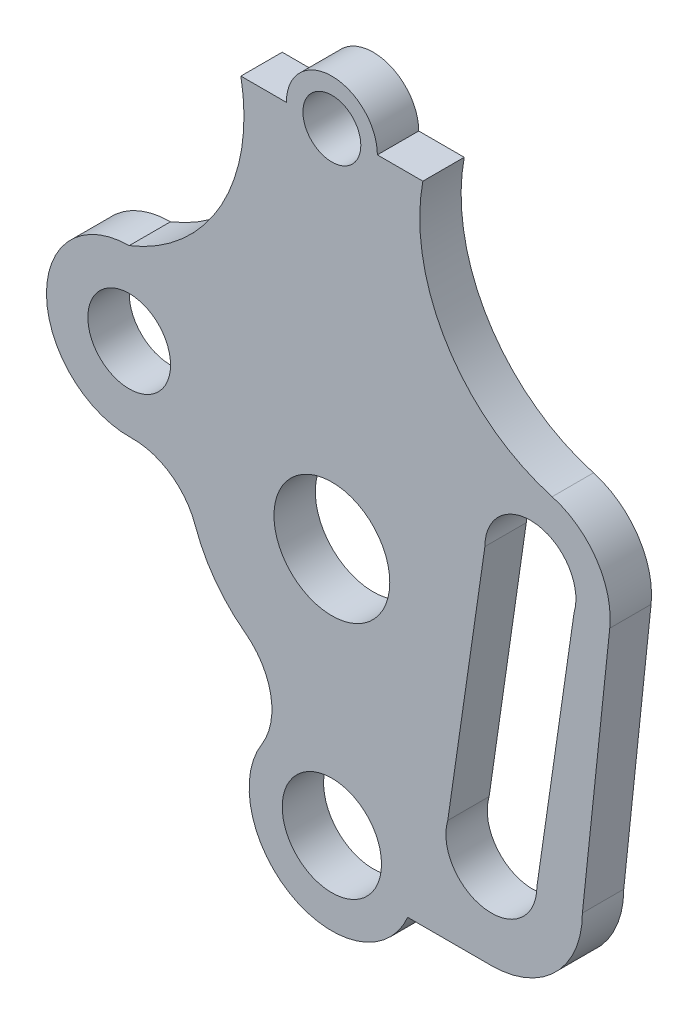
ISO-10303-21;
HEADER;
FILE_DESCRIPTION(('STEP AP214'),'2;1');
FILE_NAME('part.step','',(''),(''),'','','');
FILE_SCHEMA(('AUTOMOTIVE_DESIGN { 1 0 10303 214 1 1 1 1 }'));
ENDSEC;
DATA;
#1=APPLICATION_CONTEXT('core data for automotive mechanical design processes');
#2=APPLICATION_PROTOCOL_DEFINITION('international standard','automotive_design',2000,#1);
#3=PRODUCT_CONTEXT('',#1,'mechanical');
#4=PRODUCT('Part','Part','',(#3));
#5=PRODUCT_RELATED_PRODUCT_CATEGORY('part','',(#4));
#6=PRODUCT_DEFINITION_FORMATION('','',#4);
#7=PRODUCT_DEFINITION_CONTEXT('part definition',#1,'design');
#8=PRODUCT_DEFINITION('design','',#6,#7);
#9=PRODUCT_DEFINITION_SHAPE('','',#8);
#10=(LENGTH_UNIT() NAMED_UNIT(*) SI_UNIT(.MILLI.,.METRE.));
#11=(NAMED_UNIT(*) PLANE_ANGLE_UNIT() SI_UNIT($,.RADIAN.));
#12=(NAMED_UNIT(*) SI_UNIT($,.STERADIAN.) SOLID_ANGLE_UNIT());
#13=UNCERTAINTY_MEASURE_WITH_UNIT(LENGTH_MEASURE(1.E-05),#10,'distance_accuracy_value','');
#14=(GEOMETRIC_REPRESENTATION_CONTEXT(3) GLOBAL_UNCERTAINTY_ASSIGNED_CONTEXT((#13)) GLOBAL_UNIT_ASSIGNED_CONTEXT((#10,
#11,#12)) REPRESENTATION_CONTEXT('',''));
#15=CARTESIAN_POINT('',(0.,0.,0.));
#16=DIRECTION('',(0.,0.,1.));
#17=DIRECTION('',(1.,0.,0.));
#18=AXIS2_PLACEMENT_3D('',#15,#16,#17);
#19=CARTESIAN_POINT('',(-30.4997438513834,-40.875,5.));
#20=DIRECTION('',(0.,0.,-1.));
#21=DIRECTION('',(-1.,0.,0.));
#22=AXIS2_PLACEMENT_3D('',#19,#20,#21);
#23=CYLINDRICAL_SURFACE('',#22,16.);
#24=CARTESIAN_POINT('',(-30.4997438513834,-40.875,-5.));
#25=DIRECTION('',(0.,0.,1.));
#26=DIRECTION('',(1.,0.,0.));
#27=AXIS2_PLACEMENT_3D('',#24,#25,#26);
#28=CIRCLE('',#27,16.);
#29=CARTESIAN_POINT('',(-16.9443021396574,-49.375,-5.));
#30=VERTEX_POINT('',#29);
#31=CARTESIAN_POINT('',(-20.9311967607533,-28.0514705882353,-5.));
#32=VERTEX_POINT('',#31);
#33=EDGE_CURVE('E305',#30,#32,#28,.T.);
#34=ORIENTED_EDGE('',*,*,#33,.F.);
#35=DIRECTION('',(0.,0.,-1.));
#36=VECTOR('',#35,1.);
#37=CARTESIAN_POINT('',(-16.9443021396574,-49.375,5.));
#38=LINE('',#37,#36);
#39=CARTESIAN_POINT('',(-16.9443021396574,-49.375,5.));
#40=VERTEX_POINT('',#39);
#41=EDGE_CURVE('E11',#40,#30,#38,.T.);
#42=ORIENTED_EDGE('',*,*,#41,.F.);
#43=CARTESIAN_POINT('',(-30.4997438513834,-40.875,5.));
#44=DIRECTION('',(0.,0.,1.));
#45=DIRECTION('',(1.,0.,0.));
#46=AXIS2_PLACEMENT_3D('',#43,#44,#45);
#47=CIRCLE('',#46,16.);
#48=CARTESIAN_POINT('',(-20.9311967607533,-28.0514705882353,5.));
#49=VERTEX_POINT('',#48);
#50=EDGE_CURVE('E377',#40,#49,#47,.T.);
#51=ORIENTED_EDGE('',*,*,#50,.T.);
#52=DIRECTION('',(0.,0.,-1.));
#53=VECTOR('',#52,1.);
#54=CARTESIAN_POINT('',(-20.9311967607533,-28.0514705882353,5.));
#55=LINE('',#54,#53);
#56=EDGE_CURVE('E127',#49,#32,#55,.T.);
#57=ORIENTED_EDGE('',*,*,#56,.T.);
#58=EDGE_LOOP('',(#34,#42,#51,#57));
#59=FACE_BOUND('',#58,.T.);
#60=ADVANCED_FACE('F43',(#59),#23,.F.);
#61=CARTESIAN_POINT('',(0.,-60.,5.));
#62=DIRECTION('',(0.,0.,-1.));
#63=DIRECTION('',(-1.,0.,0.));
#64=AXIS2_PLACEMENT_3D('',#61,#62,#63);
#65=CYLINDRICAL_SURFACE('',#64,20.);
#66=CARTESIAN_POINT('',(0.,-60.,-5.));
#67=DIRECTION('',(0.,0.,1.));
#68=DIRECTION('',(1.,0.,0.));
#69=AXIS2_PLACEMENT_3D('',#66,#67,#68);
#70=CIRCLE('',#69,20.);
#71=CARTESIAN_POINT('',(18.3465511969433,-67.9626665871389,-5.));
#72=VERTEX_POINT('',#71);
#73=EDGE_CURVE('E301',#30,#72,#70,.T.);
#74=ORIENTED_EDGE('',*,*,#73,.T.);
#75=DIRECTION('',(0.,0.,-1.));
#76=VECTOR('',#75,1.);
#77=CARTESIAN_POINT('',(18.3465511969433,-67.9626665871389,5.));
#78=LINE('',#77,#76);
#79=CARTESIAN_POINT('',(18.3465511969433,-67.9626665871389,5.));
#80=VERTEX_POINT('',#79);
#81=EDGE_CURVE('E54',#80,#72,#78,.T.);
#82=ORIENTED_EDGE('',*,*,#81,.F.);
#83=CARTESIAN_POINT('',(0.,-60.,5.));
#84=DIRECTION('',(0.,0.,1.));
#85=DIRECTION('',(1.,0.,0.));
#86=AXIS2_PLACEMENT_3D('',#83,#84,#85);
#87=CIRCLE('',#86,20.);
#88=EDGE_CURVE('E373',#40,#80,#87,.T.);
#89=ORIENTED_EDGE('',*,*,#88,.F.);
#90=ORIENTED_EDGE('',*,*,#41,.T.);
#91=EDGE_LOOP('',(#74,#82,#89,#90));
#92=FACE_BOUND('',#91,.T.);
#93=ADVANCED_FACE('F442',(#92),#65,.T.);
#94=CARTESIAN_POINT('',(0.,-67.9626665871389,5.));
#95=DIRECTION('',(0.,1.,0.));
#96=DIRECTION('',(0.,0.,1.));
#97=AXIS2_PLACEMENT_3D('',#94,#95,#96);
#98=PLANE('',#97);
#99=DIRECTION('',(1.,0.,0.));
#100=VECTOR('',#99,1.);
#101=CARTESIAN_POINT('',(0.,-67.9626665871389,-5.));
#102=LINE('',#101,#100);
#103=CARTESIAN_POINT('',(38.5672565811921,-67.9626665871389,-5.));
#104=VERTEX_POINT('',#103);
#105=EDGE_CURVE('E297',#72,#104,#102,.T.);
#106=ORIENTED_EDGE('',*,*,#105,.T.);
#107=DIRECTION('',(0.,0.,-1.));
#108=VECTOR('',#107,1.);
#109=CARTESIAN_POINT('',(38.5672565811921,-67.9626665871389,5.));
#110=LINE('',#109,#108);
#111=CARTESIAN_POINT('',(38.5672565811921,-67.9626665871389,5.));
#112=VERTEX_POINT('',#111);
#113=EDGE_CURVE('E234',#112,#104,#110,.T.);
#114=ORIENTED_EDGE('',*,*,#113,.F.);
#115=DIRECTION('',(1.,0.,0.));
#116=VECTOR('',#115,1.);
#117=CARTESIAN_POINT('',(0.,-67.9626665871389,5.));
#118=LINE('',#117,#116);
#119=EDGE_CURVE('E369',#80,#112,#118,.T.);
#120=ORIENTED_EDGE('',*,*,#119,.F.);
#121=ORIENTED_EDGE('',*,*,#81,.T.);
#122=EDGE_LOOP('',(#106,#114,#120,#121));
#123=FACE_BOUND('',#122,.T.);
#124=ADVANCED_FACE('F447',(#123),#98,.F.);
#125=CARTESIAN_POINT('',(38.5672565811921,-45.9626665871389,5.));
#126=DIRECTION('',(0.,0.,-1.));
#127=DIRECTION('',(-1.,0.,0.));
#128=AXIS2_PLACEMENT_3D('',#125,#126,#127);
#129=CYLINDRICAL_SURFACE('',#128,22.);
#130=CARTESIAN_POINT('',(38.5672565811921,-45.9626665871389,-5.));
#131=DIRECTION('',(0.,0.,1.));
#132=DIRECTION('',(1.,0.,0.));
#133=AXIS2_PLACEMENT_3D('',#130,#131,#132);
#134=CIRCLE('',#133,22.);
#135=CARTESIAN_POINT('',(60.5672565811921,-45.9626665871389,-5.));
#136=VERTEX_POINT('',#135);
#137=EDGE_CURVE('E293',#104,#136,#134,.T.);
#138=ORIENTED_EDGE('',*,*,#137,.T.);
#139=DIRECTION('',(0.,0.,-1.));
#140=VECTOR('',#139,1.);
#141=CARTESIAN_POINT('',(60.5672565811921,-45.9626665871389,5.));
#142=LINE('',#141,#140);
#143=CARTESIAN_POINT('',(60.5672565811921,-45.9626665871389,5.));
#144=VERTEX_POINT('',#143);
#145=EDGE_CURVE('E231',#144,#136,#142,.T.);
#146=ORIENTED_EDGE('',*,*,#145,.F.);
#147=CARTESIAN_POINT('',(38.5672565811921,-45.9626665871389,5.));
#148=DIRECTION('',(0.,0.,1.));
#149=DIRECTION('',(1.,0.,0.));
#150=AXIS2_PLACEMENT_3D('',#147,#148,#149);
#151=CIRCLE('',#150,22.);
#152=EDGE_CURVE('E366',#112,#144,#151,.T.);
#153=ORIENTED_EDGE('',*,*,#152,.F.);
#154=ORIENTED_EDGE('',*,*,#113,.T.);
#155=EDGE_LOOP('',(#138,#146,#153,#154));
#156=FACE_BOUND('',#155,.T.);
#157=ADVANCED_FACE('F648',(#156),#129,.T.);
#158=CARTESIAN_POINT('',(64.6821409647,-6.79547069058715,5.));
#159=DIRECTION('',(0.994526523743526,-0.104484417836431,0.));
#160=DIRECTION('',(0.104484417836431,0.994526523743526,0.));
#161=AXIS2_PLACEMENT_3D('',#158,#159,#160);
#162=PLANE('',#161);
#163=DIRECTION('',(-0.104484417836431,-0.994526523743526,0.));
#164=VECTOR('',#163,1.);
#165=CARTESIAN_POINT('',(64.6821409647,-6.79547069058715,-5.));
#166=LINE('',#165,#164);
#167=CARTESIAN_POINT('',(67.1804946283581,16.9849076246702,-5.));
#168=VERTEX_POINT('',#167);
#169=EDGE_CURVE('E289',#168,#136,#166,.T.);
#170=ORIENTED_EDGE('',*,*,#169,.F.);
#171=DIRECTION('',(0.,0.,-1.));
#172=VECTOR('',#171,1.);
#173=CARTESIAN_POINT('',(67.1804946283581,16.9849076246702,5.));
#174=LINE('',#173,#172);
#175=CARTESIAN_POINT('',(67.1804946283581,16.9849076246702,5.));
#176=VERTEX_POINT('',#175);
#177=EDGE_CURVE('E228',#176,#168,#174,.T.);
#178=ORIENTED_EDGE('',*,*,#177,.F.);
#179=DIRECTION('',(-0.104484417836431,-0.994526523743526,0.));
#180=VECTOR('',#179,1.);
#181=CARTESIAN_POINT('',(64.6821409647,-6.79547069058715,5.));
#182=LINE('',#181,#180);
#183=EDGE_CURVE('E362',#176,#144,#182,.T.);
#184=ORIENTED_EDGE('',*,*,#183,.T.);
#185=ORIENTED_EDGE('',*,*,#145,.T.);
#186=EDGE_LOOP('',(#170,#178,#184,#185));
#187=FACE_BOUND('',#186,.T.);
#188=ADVANCED_FACE('F637',(#187),#162,.T.);
#189=CARTESIAN_POINT('',(48.,19.,5.));
#190=DIRECTION('',(0.,0.,-1.));
#191=DIRECTION('',(-1.,0.,0.));
#192=AXIS2_PLACEMENT_3D('',#189,#190,#191);
#193=CYLINDRICAL_SURFACE('',#192,19.2860564001453);
#194=CARTESIAN_POINT('',(48.,19.,-5.));
#195=DIRECTION('',(0.,0.,1.));
#196=DIRECTION('',(1.,0.,0.));
#197=AXIS2_PLACEMENT_3D('',#194,#195,#196);
#198=CIRCLE('',#197,19.2860564001453);
#199=CARTESIAN_POINT('',(53.255704218525,37.5561187923813,-5.));
#200=VERTEX_POINT('',#199);
#201=EDGE_CURVE('E285',#168,#200,#198,.T.);
#202=ORIENTED_EDGE('',*,*,#201,.T.);
#203=DIRECTION('',(0.,0.,-1.));
#204=VECTOR('',#203,1.);
#205=CARTESIAN_POINT('',(53.255704218525,37.5561187923813,5.));
#206=LINE('',#205,#204);
#207=CARTESIAN_POINT('',(53.255704218525,37.5561187923813,5.));
#208=VERTEX_POINT('',#207);
#209=EDGE_CURVE('E225',#208,#200,#206,.T.);
#210=ORIENTED_EDGE('',*,*,#209,.F.);
#211=CARTESIAN_POINT('',(48.,19.,5.));
#212=DIRECTION('',(0.,0.,1.));
#213=DIRECTION('',(1.,0.,0.));
#214=AXIS2_PLACEMENT_3D('',#211,#212,#213);
#215=CIRCLE('',#214,19.2860564001453);
#216=EDGE_CURVE('E359',#176,#208,#215,.T.);
#217=ORIENTED_EDGE('',*,*,#216,.F.);
#218=ORIENTED_EDGE('',*,*,#177,.T.);
#219=EDGE_LOOP('',(#202,#210,#217,#218));
#220=FACE_BOUND('',#219,.T.);
#221=ADVANCED_FACE('F626',(#220),#193,.T.);
#222=CARTESIAN_POINT('',(65.2462833611515,79.8908091990018,5.));
#223=DIRECTION('',(0.,0.,-1.));
#224=DIRECTION('',(-1.,0.,0.));
#225=AXIS2_PLACEMENT_3D('',#222,#223,#224);
#226=CYLINDRICAL_SURFACE('',#225,44.);
#227=CARTESIAN_POINT('',(65.2462833611515,79.8908091990018,-5.));
#228=DIRECTION('',(0.,0.,1.));
#229=DIRECTION('',(1.,0.,0.));
#230=AXIS2_PLACEMENT_3D('',#227,#228,#229);
#231=CIRCLE('',#230,44.);
#232=CARTESIAN_POINT('',(22.,88.,-5.));
#233=VERTEX_POINT('',#232);
#234=EDGE_CURVE('E281',#233,#200,#231,.T.);
#235=ORIENTED_EDGE('',*,*,#234,.F.);
#236=DIRECTION('',(0.,0.,-1.));
#237=VECTOR('',#236,1.);
#238=CARTESIAN_POINT('',(22.,88.,5.));
#239=LINE('',#238,#237);
#240=CARTESIAN_POINT('',(22.,88.,5.));
#241=VERTEX_POINT('',#240);
#242=EDGE_CURVE('E222',#241,#233,#239,.T.);
#243=ORIENTED_EDGE('',*,*,#242,.F.);
#244=CARTESIAN_POINT('',(65.2462833611515,79.8908091990018,5.));
#245=DIRECTION('',(0.,0.,1.));
#246=DIRECTION('',(1.,0.,0.));
#247=AXIS2_PLACEMENT_3D('',#244,#245,#246);
#248=CIRCLE('',#247,44.);
#249=EDGE_CURVE('E355',#241,#208,#248,.T.);
#250=ORIENTED_EDGE('',*,*,#249,.T.);
#251=ORIENTED_EDGE('',*,*,#209,.T.);
#252=EDGE_LOOP('',(#235,#243,#250,#251));
#253=FACE_BOUND('',#252,.T.);
#254=ADVANCED_FACE('F615',(#253),#226,.F.);
#255=CARTESIAN_POINT('',(0.,88.,5.));
#256=DIRECTION('',(0.,1.,0.));
#257=DIRECTION('',(0.,0.,1.));
#258=AXIS2_PLACEMENT_3D('',#255,#256,#257);
#259=PLANE('',#258);
#260=DIRECTION('',(1.,0.,0.));
#261=VECTOR('',#260,1.);
#262=CARTESIAN_POINT('',(0.,88.,-5.));
#263=LINE('',#262,#261);
#264=CARTESIAN_POINT('',(11.,88.,-5.));
#265=VERTEX_POINT('',#264);
#266=EDGE_CURVE('E277',#265,#233,#263,.T.);
#267=ORIENTED_EDGE('',*,*,#266,.F.);
#268=DIRECTION('',(0.,0.,-1.));
#269=VECTOR('',#268,1.);
#270=CARTESIAN_POINT('',(11.,88.,5.));
#271=LINE('',#270,#269);
#272=CARTESIAN_POINT('',(11.,88.,5.));
#273=VERTEX_POINT('',#272);
#274=EDGE_CURVE('E219',#273,#265,#271,.T.);
#275=ORIENTED_EDGE('',*,*,#274,.F.);
#276=DIRECTION('',(1.,0.,0.));
#277=VECTOR('',#276,1.);
#278=CARTESIAN_POINT('',(0.,88.,5.));
#279=LINE('',#278,#277);
#280=EDGE_CURVE('E351',#273,#241,#279,.T.);
#281=ORIENTED_EDGE('',*,*,#280,.T.);
#282=ORIENTED_EDGE('',*,*,#242,.T.);
#283=EDGE_LOOP('',(#267,#275,#281,#282));
#284=FACE_BOUND('',#283,.T.);
#285=ADVANCED_FACE('F604',(#284),#259,.T.);
#286=CARTESIAN_POINT('',(0.,88.,5.));
#287=DIRECTION('',(0.,0.,-1.));
#288=DIRECTION('',(-1.,0.,0.));
#289=AXIS2_PLACEMENT_3D('',#286,#287,#288);
#290=CYLINDRICAL_SURFACE('',#289,11.);
#291=CARTESIAN_POINT('',(0.,88.,-5.));
#292=DIRECTION('',(0.,0.,1.));
#293=DIRECTION('',(1.,0.,0.));
#294=AXIS2_PLACEMENT_3D('',#291,#292,#293);
#295=CIRCLE('',#294,11.);
#296=CARTESIAN_POINT('',(-11.,88.,-5.));
#297=VERTEX_POINT('',#296);
#298=EDGE_CURVE('E273',#265,#297,#295,.T.);
#299=ORIENTED_EDGE('',*,*,#298,.T.);
#300=DIRECTION('',(0.,0.,-1.));
#301=VECTOR('',#300,1.);
#302=CARTESIAN_POINT('',(-11.,88.,5.));
#303=LINE('',#302,#301);
#304=CARTESIAN_POINT('',(-11.,88.,5.));
#305=VERTEX_POINT('',#304);
#306=EDGE_CURVE('E215',#305,#297,#303,.T.);
#307=ORIENTED_EDGE('',*,*,#306,.F.);
#308=CARTESIAN_POINT('',(0.,88.,5.));
#309=DIRECTION('',(0.,0.,1.));
#310=DIRECTION('',(1.,0.,0.));
#311=AXIS2_PLACEMENT_3D('',#308,#309,#310);
#312=CIRCLE('',#311,11.);
#313=EDGE_CURVE('E347',#273,#305,#312,.T.);
#314=ORIENTED_EDGE('',*,*,#313,.F.);
#315=ORIENTED_EDGE('',*,*,#274,.T.);
#316=EDGE_LOOP('',(#299,#307,#314,#315));
#317=FACE_BOUND('',#316,.T.);
#318=ADVANCED_FACE('F593',(#317),#290,.T.);
#319=CARTESIAN_POINT('',(0.,88.,5.));
#320=DIRECTION('',(0.,-1.,0.));
#321=DIRECTION('',(0.,0.,-1.));
#322=AXIS2_PLACEMENT_3D('',#319,#320,#321);
#323=PLANE('',#322);
#324=DIRECTION('',(-1.,0.,0.));
#325=VECTOR('',#324,1.);
#326=CARTESIAN_POINT('',(0.,88.,-5.));
#327=LINE('',#326,#325);
#328=CARTESIAN_POINT('',(-22.,88.,-5.));
#329=VERTEX_POINT('',#328);
#330=EDGE_CURVE('E269',#297,#329,#327,.T.);
#331=ORIENTED_EDGE('',*,*,#330,.T.);
#332=DIRECTION('',(0.,0.,-1.));
#333=VECTOR('',#332,1.);
#334=CARTESIAN_POINT('',(-22.,88.,5.));
#335=LINE('',#334,#333);
#336=CARTESIAN_POINT('',(-22.,88.,5.));
#337=VERTEX_POINT('',#336);
#338=EDGE_CURVE('E207',#337,#329,#335,.T.);
#339=ORIENTED_EDGE('',*,*,#338,.F.);
#340=DIRECTION('',(-1.,0.,0.));
#341=VECTOR('',#340,1.);
#342=CARTESIAN_POINT('',(0.,88.,5.));
#343=LINE('',#342,#341);
#344=EDGE_CURVE('E344',#305,#337,#343,.T.);
#345=ORIENTED_EDGE('',*,*,#344,.F.);
#346=ORIENTED_EDGE('',*,*,#306,.T.);
#347=EDGE_LOOP('',(#331,#339,#345,#346));
#348=FACE_BOUND('',#347,.T.);
#349=ADVANCED_FACE('F582',(#348),#323,.F.);
#350=CARTESIAN_POINT('',(-65.2462833611515,79.8908091990018,5.));
#351=DIRECTION('',(0.,0.,-1.));
#352=DIRECTION('',(-1.,0.,0.));
#353=AXIS2_PLACEMENT_3D('',#350,#351,#352);
#354=CYLINDRICAL_SURFACE('',#353,44.);
#355=CARTESIAN_POINT('',(-65.2462833611515,79.8908091990018,-5.));
#356=DIRECTION('',(0.,0.,1.));
#357=DIRECTION('',(1.,0.,0.));
#358=AXIS2_PLACEMENT_3D('',#355,#356,#357);
#359=CIRCLE('',#358,44.);
#360=CARTESIAN_POINT('',(-49.,39.,-5.));
#361=VERTEX_POINT('',#360);
#362=EDGE_CURVE('E265',#329,#361,#359,.F.);
#363=ORIENTED_EDGE('',*,*,#362,.T.);
#364=DIRECTION('',(0.,0.,-1.));
#365=VECTOR('',#364,1.);
#366=CARTESIAN_POINT('',(-49.,39.,5.));
#367=LINE('',#366,#365);
#368=CARTESIAN_POINT('',(-49.,39.,5.));
#369=VERTEX_POINT('',#368);
#370=EDGE_CURVE('E203',#369,#361,#367,.T.);
#371=ORIENTED_EDGE('',*,*,#370,.F.);
#372=CARTESIAN_POINT('',(-65.2462833611515,79.8908091990018,5.));
#373=DIRECTION('',(0.,0.,1.));
#374=DIRECTION('',(1.,0.,0.));
#375=AXIS2_PLACEMENT_3D('',#372,#373,#374);
#376=CIRCLE('',#375,44.);
#377=EDGE_CURVE('E194',#337,#369,#376,.F.);
#378=ORIENTED_EDGE('',*,*,#377,.F.);
#379=ORIENTED_EDGE('',*,*,#338,.T.);
#380=EDGE_LOOP('',(#363,#371,#378,#379));
#381=FACE_BOUND('',#380,.T.);
#382=ADVANCED_FACE('F572',(#381),#354,.F.);
#383=CARTESIAN_POINT('',(-49.,19.,5.));
#384=DIRECTION('',(0.,0.,-1.));
#385=DIRECTION('',(-1.,0.,0.));
#386=AXIS2_PLACEMENT_3D('',#383,#384,#385);
#387=CYLINDRICAL_SURFACE('',#386,20.);
#388=CARTESIAN_POINT('',(-49.,19.,-5.));
#389=DIRECTION('',(0.,0.,1.));
#390=DIRECTION('',(1.,0.,0.));
#391=AXIS2_PLACEMENT_3D('',#388,#389,#390);
#392=CIRCLE('',#391,20.);
#393=CARTESIAN_POINT('',(-48.4929723790289,-0.993572041823165,-5.));
#394=VERTEX_POINT('',#393);
#395=EDGE_CURVE('E201',#361,#394,#392,.T.);
#396=ORIENTED_EDGE('',*,*,#395,.T.);
#397=DIRECTION('',(0.,0.,-1.));
#398=VECTOR('',#397,1.);
#399=CARTESIAN_POINT('',(-48.4929723790289,-0.993572041823165,5.));
#400=LINE('',#399,#398);
#401=CARTESIAN_POINT('',(-48.4929723790289,-0.993572041823165,5.));
#402=VERTEX_POINT('',#401);
#403=EDGE_CURVE('E185',#402,#394,#400,.T.);
#404=ORIENTED_EDGE('',*,*,#403,.F.);
#405=CARTESIAN_POINT('',(-49.,19.,5.));
#406=DIRECTION('',(0.,0.,1.));
#407=DIRECTION('',(1.,0.,0.));
#408=AXIS2_PLACEMENT_3D('',#405,#406,#407);
#409=CIRCLE('',#408,20.);
#410=EDGE_CURVE('E189',#369,#402,#409,.T.);
#411=ORIENTED_EDGE('',*,*,#410,.F.);
#412=ORIENTED_EDGE('',*,*,#370,.T.);
#413=EDGE_LOOP('',(#396,#404,#411,#412));
#414=FACE_BOUND('',#413,.T.);
#415=ADVANCED_FACE('F200',(#414),#387,.T.);
#416=CARTESIAN_POINT('',(-48.0873502822521,-16.9884296752817,5.));
#417=DIRECTION('',(0.,0.,-1.));
#418=DIRECTION('',(-1.,0.,0.));
#419=AXIS2_PLACEMENT_3D('',#416,#417,#418);
#420=CYLINDRICAL_SURFACE('',#419,16.);
#421=CARTESIAN_POINT('',(-48.0873502822521,-16.9884296752817,-5.));
#422=DIRECTION('',(0.,0.,1.));
#423=DIRECTION('',(1.,0.,0.));
#424=AXIS2_PLACEMENT_3D('',#421,#422,#423);
#425=CIRCLE('',#424,16.);
#426=CARTESIAN_POINT('',(-33.001122742722,-11.6587262477423,-5.));
#427=VERTEX_POINT('',#426);
#428=EDGE_CURVE('E260',#394,#427,#425,.F.);
#429=ORIENTED_EDGE('',*,*,#428,.T.);
#430=DIRECTION('',(0.,0.,-1.));
#431=VECTOR('',#430,1.);
#432=CARTESIAN_POINT('',(-33.001122742722,-11.6587262477423,5.));
#433=LINE('',#432,#431);
#434=CARTESIAN_POINT('',(-33.001122742722,-11.6587262477423,5.));
#435=VERTEX_POINT('',#434);
#436=EDGE_CURVE('E187',#435,#427,#433,.T.);
#437=ORIENTED_EDGE('',*,*,#436,.F.);
#438=CARTESIAN_POINT('',(-48.0873502822521,-16.9884296752817,5.));
#439=DIRECTION('',(0.,0.,1.));
#440=DIRECTION('',(1.,0.,0.));
#441=AXIS2_PLACEMENT_3D('',#438,#439,#440);
#442=CIRCLE('',#441,16.);
#443=EDGE_CURVE('E180',#402,#435,#442,.F.);
#444=ORIENTED_EDGE('',*,*,#443,.F.);
#445=ORIENTED_EDGE('',*,*,#403,.T.);
#446=EDGE_LOOP('',(#429,#437,#444,#445));
#447=FACE_BOUND('',#446,.T.);
#448=ADVANCED_FACE('F183',(#447),#420,.F.);
#449=CARTESIAN_POINT('',(38.5672565811921,-45.9626665871389,5.));
#450=DIRECTION('',(0.,0.,-1.));
#451=DIRECTION('',(-1.,0.,0.));
#452=AXIS2_PLACEMENT_3D('',#449,#450,#451);
#453=CYLINDRICAL_SURFACE('',#452,11.);
#454=CARTESIAN_POINT('',(38.5672565811921,-45.9626665871389,-5.));
#455=DIRECTION('',(0.,0.,1.));
#456=DIRECTION('',(1.,0.,0.));
#457=AXIS2_PLACEMENT_3D('',#454,#455,#456);
#458=CIRCLE('',#457,11.);
#459=CARTESIAN_POINT('',(28.0215219835336,-42.8341714543717,-5.));
#460=VERTEX_POINT('',#459);
#461=CARTESIAN_POINT('',(49.5672565811921,-45.9626665871389,-5.));
#462=VERTEX_POINT('',#461);
#463=EDGE_CURVE('E320',#460,#462,#458,.T.);
#464=ORIENTED_EDGE('',*,*,#463,.F.);
#465=DIRECTION('',(0.,0.,-1.));
#466=VECTOR('',#465,1.);
#467=CARTESIAN_POINT('',(28.0215219835336,-42.8341714543717,5.));
#468=LINE('',#467,#466);
#469=CARTESIAN_POINT('',(28.0215219835336,-42.8341714543717,5.));
#470=VERTEX_POINT('',#469);
#471=EDGE_CURVE('E47',#470,#460,#468,.T.);
#472=ORIENTED_EDGE('',*,*,#471,.F.);
#473=CARTESIAN_POINT('',(38.5672565811921,-45.9626665871389,5.));
#474=DIRECTION('',(0.,0.,1.));
#475=DIRECTION('',(1.,0.,0.));
#476=AXIS2_PLACEMENT_3D('',#473,#474,#475);
#477=CIRCLE('',#476,11.);
#478=CARTESIAN_POINT('',(49.5672565811921,-45.9626665871389,5.));
#479=VERTEX_POINT('',#478);
#480=EDGE_CURVE('E389',#470,#479,#477,.T.);
#481=ORIENTED_EDGE('',*,*,#480,.T.);
#482=DIRECTION('',(0.,0.,-1.));
#483=VECTOR('',#482,1.);
#484=CARTESIAN_POINT('',(49.5672565811921,-45.9626665871389,5.));
#485=LINE('',#484,#483);
#486=EDGE_CURVE('E241',#479,#462,#485,.T.);
#487=ORIENTED_EDGE('',*,*,#486,.T.);
#488=EDGE_LOOP('',(#464,#472,#481,#487));
#489=FACE_BOUND('',#488,.T.);
#490=ADVANCED_FACE('F431',(#489),#453,.F.);
#491=CARTESIAN_POINT('',(33.534126026854,-4.86923987581361,5.));
#492=DIRECTION('',(0.989621934185395,-0.143695606680088,0.));
#493=DIRECTION('',(0.143695606680088,0.989621934185395,0.));
#494=AXIS2_PLACEMENT_3D('',#491,#492,#493);
#495=PLANE('',#494);
#496=DIRECTION('',(-0.143695606680088,-0.989621934185395,0.));
#497=VECTOR('',#496,1.);
#498=CARTESIAN_POINT('',(33.534126026854,-4.86923987581361,-5.));
#499=LINE('',#498,#497);
#500=CARTESIAN_POINT('',(37.,19.,-5.));
#501=VERTEX_POINT('',#500);
#502=EDGE_CURVE('E316',#501,#460,#499,.T.);
#503=ORIENTED_EDGE('',*,*,#502,.F.);
#504=DIRECTION('',(0.,0.,-1.));
#505=VECTOR('',#504,1.);
#506=CARTESIAN_POINT('',(37.,19.,5.));
#507=LINE('',#506,#505);
#508=CARTESIAN_POINT('',(37.,19.,5.));
#509=VERTEX_POINT('',#508);
#510=EDGE_CURVE('E246',#509,#501,#507,.T.);
#511=ORIENTED_EDGE('',*,*,#510,.F.);
#512=DIRECTION('',(-0.143695606680088,-0.989621934185395,0.));
#513=VECTOR('',#512,1.);
#514=CARTESIAN_POINT('',(33.534126026854,-4.86923987581361,5.));
#515=LINE('',#514,#513);
#516=EDGE_CURVE('E386',#509,#470,#515,.T.);
#517=ORIENTED_EDGE('',*,*,#516,.T.);
#518=ORIENTED_EDGE('',*,*,#471,.T.);
#519=EDGE_LOOP('',(#503,#511,#517,#518));
#520=FACE_BOUND('',#519,.T.);
#521=ADVANCED_FACE('F425',(#520),#495,.T.);
#522=CARTESIAN_POINT('',(48.,19.,5.));
#523=DIRECTION('',(0.,0.,-1.));
#524=DIRECTION('',(-1.,0.,0.));
#525=AXIS2_PLACEMENT_3D('',#522,#523,#524);
#526=CYLINDRICAL_SURFACE('',#525,11.);
#527=CARTESIAN_POINT('',(48.,19.,-5.));
#528=DIRECTION('',(0.,0.,1.));
#529=DIRECTION('',(1.,0.,0.));
#530=AXIS2_PLACEMENT_3D('',#527,#528,#529);
#531=CIRCLE('',#530,11.);
#532=CARTESIAN_POINT('',(58.5457345976585,15.8715048672328,-5.));
#533=VERTEX_POINT('',#532);
#534=EDGE_CURVE('E312',#533,#501,#531,.T.);
#535=ORIENTED_EDGE('',*,*,#534,.F.);
#536=DIRECTION('',(0.,0.,-1.));
#537=VECTOR('',#536,1.);
#538=CARTESIAN_POINT('',(58.5457345976585,15.8715048672328,5.));
#539=LINE('',#538,#537);
#540=CARTESIAN_POINT('',(58.5457345976585,15.8715048672328,5.));
#541=VERTEX_POINT('',#540);
#542=EDGE_CURVE('E244',#541,#533,#539,.T.);
#543=ORIENTED_EDGE('',*,*,#542,.F.);
#544=CARTESIAN_POINT('',(48.,19.,5.));
#545=DIRECTION('',(0.,0.,1.));
#546=DIRECTION('',(1.,0.,0.));
#547=AXIS2_PLACEMENT_3D('',#544,#545,#546);
#548=CIRCLE('',#547,11.);
#549=EDGE_CURVE('E383',#541,#509,#548,.T.);
#550=ORIENTED_EDGE('',*,*,#549,.T.);
#551=ORIENTED_EDGE('',*,*,#510,.T.);
#552=EDGE_LOOP('',(#535,#543,#550,#551));
#553=FACE_BOUND('',#552,.T.);
#554=ADVANCED_FACE('F428',(#553),#526,.F.);
#555=CARTESIAN_POINT('',(55.0798606245125,-7.99773500858086,5.));
#556=DIRECTION('',(0.989621934185395,-0.143695606680088,0.));
#557=DIRECTION('',(0.143695606680088,0.989621934185395,0.));
#558=AXIS2_PLACEMENT_3D('',#555,#556,#557);
#559=PLANE('',#558);
#560=DIRECTION('',(-0.143695606680088,-0.989621934185395,0.));
#561=VECTOR('',#560,1.);
#562=CARTESIAN_POINT('',(55.0798606245125,-7.99773500858086,-5.));
#563=LINE('',#562,#561);
#564=EDGE_CURVE('E308',#533,#462,#563,.T.);
#565=ORIENTED_EDGE('',*,*,#564,.T.);
#566=ORIENTED_EDGE('',*,*,#486,.F.);
#567=DIRECTION('',(-0.143695606680088,-0.989621934185395,0.));
#568=VECTOR('',#567,1.);
#569=CARTESIAN_POINT('',(55.0798606245125,-7.99773500858086,5.));
#570=LINE('',#569,#568);
#571=EDGE_CURVE('E380',#541,#479,#570,.T.);
#572=ORIENTED_EDGE('',*,*,#571,.F.);
#573=ORIENTED_EDGE('',*,*,#542,.T.);
#574=EDGE_LOOP('',(#565,#566,#572,#573));
#575=FACE_BOUND('',#574,.T.);
#576=ADVANCED_FACE('F430',(#575),#559,.F.);
#577=CARTESIAN_POINT('',(-49.,19.,5.));
#578=DIRECTION('',(0.,0.,-1.));
#579=DIRECTION('',(-1.,0.,0.));
#580=AXIS2_PLACEMENT_3D('',#577,#578,#579);
#581=CYLINDRICAL_SURFACE('',#580,10.);
#582=CARTESIAN_POINT('',(-49.,19.,5.));
#583=DIRECTION('',(0.,0.,1.));
#584=DIRECTION('',(1.,0.,0.));
#585=AXIS2_PLACEMENT_3D('',#582,#583,#584);
#586=CIRCLE('',#585,10.);
#587=CARTESIAN_POINT('',(-39.,19.,5.));
#588=VERTEX_POINT('',#587);
#589=EDGE_CURVE('E392',#588,#588,#586,.T.);
#590=ORIENTED_EDGE('',*,*,#589,.T.);
#591=EDGE_LOOP('',(#590));
#592=FACE_BOUND('',#591,.T.);
#593=CARTESIAN_POINT('',(-49.,19.,-5.));
#594=DIRECTION('',(0.,0.,1.));
#595=DIRECTION('',(1.,0.,0.));
#596=AXIS2_PLACEMENT_3D('',#593,#594,#595);
#597=CIRCLE('',#596,10.);
#598=CARTESIAN_POINT('',(-39.,19.,-5.));
#599=VERTEX_POINT('',#598);
#600=EDGE_CURVE('E324',#599,#599,#597,.T.);
#601=ORIENTED_EDGE('',*,*,#600,.F.);
#602=EDGE_LOOP('',(#601));
#603=FACE_BOUND('',#602,.T.);
#604=ADVANCED_FACE('F454',(#592,#603),#581,.F.);
#605=CARTESIAN_POINT('',(0.,88.,5.));
#606=DIRECTION('',(0.,0.,-1.));
#607=DIRECTION('',(-1.,0.,0.));
#608=AXIS2_PLACEMENT_3D('',#605,#606,#607);
#609=CYLINDRICAL_SURFACE('',#608,7.);
#610=CARTESIAN_POINT('',(0.,88.,5.));
#611=DIRECTION('',(0.,0.,1.));
#612=DIRECTION('',(1.,0.,0.));
#613=AXIS2_PLACEMENT_3D('',#610,#611,#612);
#614=CIRCLE('',#613,7.);
#615=CARTESIAN_POINT('',(7.,88.,5.));
#616=VERTEX_POINT('',#615);
#617=EDGE_CURVE('E396',#616,#616,#614,.T.);
#618=ORIENTED_EDGE('',*,*,#617,.T.);
#619=EDGE_LOOP('',(#618));
#620=FACE_BOUND('',#619,.T.);
#621=CARTESIAN_POINT('',(0.,88.,-5.));
#622=DIRECTION('',(0.,0.,1.));
#623=DIRECTION('',(1.,0.,0.));
#624=AXIS2_PLACEMENT_3D('',#621,#622,#623);
#625=CIRCLE('',#624,7.);
#626=CARTESIAN_POINT('',(7.,88.,-5.));
#627=VERTEX_POINT('',#626);
#628=EDGE_CURVE('E328',#627,#627,#625,.T.);
#629=ORIENTED_EDGE('',*,*,#628,.F.);
#630=EDGE_LOOP('',(#629));
#631=FACE_BOUND('',#630,.T.);
#632=ADVANCED_FACE('F470',(#620,#631),#609,.F.);
#633=CARTESIAN_POINT('',(0.,-60.,5.));
#634=DIRECTION('',(0.,0.,-1.));
#635=DIRECTION('',(-1.,0.,0.));
#636=AXIS2_PLACEMENT_3D('',#633,#634,#635);
#637=CYLINDRICAL_SURFACE('',#636,12.);
#638=CARTESIAN_POINT('',(0.,-60.,5.));
#639=DIRECTION('',(0.,0.,1.));
#640=DIRECTION('',(1.,0.,0.));
#641=AXIS2_PLACEMENT_3D('',#638,#639,#640);
#642=CIRCLE('',#641,12.);
#643=CARTESIAN_POINT('',(12.,-60.,5.));
#644=VERTEX_POINT('',#643);
#645=EDGE_CURVE('E400',#644,#644,#642,.T.);
#646=ORIENTED_EDGE('',*,*,#645,.T.);
#647=EDGE_LOOP('',(#646));
#648=FACE_BOUND('',#647,.T.);
#649=CARTESIAN_POINT('',(0.,-60.,-5.));
#650=DIRECTION('',(0.,0.,1.));
#651=DIRECTION('',(1.,0.,0.));
#652=AXIS2_PLACEMENT_3D('',#649,#650,#651);
#653=CIRCLE('',#652,12.);
#654=CARTESIAN_POINT('',(12.,-60.,-5.));
#655=VERTEX_POINT('',#654);
#656=EDGE_CURVE('E332',#655,#655,#653,.T.);
#657=ORIENTED_EDGE('',*,*,#656,.F.);
#658=EDGE_LOOP('',(#657));
#659=FACE_BOUND('',#658,.T.);
#660=ADVANCED_FACE('F477',(#648,#659),#637,.F.);
#661=CARTESIAN_POINT('',(0.,0.,5.));
#662=DIRECTION('',(0.,0.,-1.));
#663=DIRECTION('',(-1.,0.,0.));
#664=AXIS2_PLACEMENT_3D('',#661,#662,#663);
#665=CYLINDRICAL_SURFACE('',#664,14.);
#666=CARTESIAN_POINT('',(0.,0.,5.));
#667=DIRECTION('',(0.,0.,1.));
#668=DIRECTION('',(1.,0.,0.));
#669=AXIS2_PLACEMENT_3D('',#666,#667,#668);
#670=CIRCLE('',#669,14.);
#671=CARTESIAN_POINT('',(14.,0.,5.));
#672=VERTEX_POINT('',#671);
#673=EDGE_CURVE('E259',#672,#672,#670,.T.);
#674=ORIENTED_EDGE('',*,*,#673,.T.);
#675=EDGE_LOOP('',(#674));
#676=FACE_BOUND('',#675,.T.);
#677=CARTESIAN_POINT('',(0.,0.,-5.));
#678=DIRECTION('',(0.,0.,1.));
#679=DIRECTION('',(1.,0.,0.));
#680=AXIS2_PLACEMENT_3D('',#677,#678,#679);
#681=CIRCLE('',#680,14.);
#682=CARTESIAN_POINT('',(14.,0.,-5.));
#683=VERTEX_POINT('',#682);
#684=EDGE_CURVE('E336',#683,#683,#681,.T.);
#685=ORIENTED_EDGE('',*,*,#684,.F.);
#686=EDGE_LOOP('',(#685));
#687=FACE_BOUND('',#686,.T.);
#688=ADVANCED_FACE('F45',(#676,#687),#665,.F.);
#689=CARTESIAN_POINT('',(0.,0.,5.));
#690=DIRECTION('',(0.,0.,-1.));
#691=DIRECTION('',(-1.,0.,0.));
#692=AXIS2_PLACEMENT_3D('',#689,#690,#691);
#693=CYLINDRICAL_SURFACE('',#692,35.);
#694=CARTESIAN_POINT('',(0.,0.,-5.));
#695=DIRECTION('',(0.,0.,1.));
#696=DIRECTION('',(1.,0.,0.));
#697=AXIS2_PLACEMENT_3D('',#694,#695,#696);
#698=CIRCLE('',#697,35.);
#699=EDGE_CURVE('E120',#427,#32,#698,.T.);
#700=ORIENTED_EDGE('',*,*,#699,.T.);
#701=ORIENTED_EDGE('',*,*,#56,.F.);
#702=CARTESIAN_POINT('',(0.,0.,5.));
#703=DIRECTION('',(0.,0.,1.));
#704=DIRECTION('',(1.,0.,0.));
#705=AXIS2_PLACEMENT_3D('',#702,#703,#704);
#706=CIRCLE('',#705,35.);
#707=EDGE_CURVE('E63',#435,#49,#706,.T.);
#708=ORIENTED_EDGE('',*,*,#707,.F.);
#709=ORIENTED_EDGE('',*,*,#436,.T.);
#710=EDGE_LOOP('',(#700,#701,#708,#709));
#711=FACE_BOUND('',#710,.T.);
#712=ADVANCED_FACE('F413',(#711),#693,.T.);
#713=CARTESIAN_POINT('',(0.,0.,5.));
#714=DIRECTION('',(0.,0.,1.));
#715=DIRECTION('',(1.,0.,0.));
#716=AXIS2_PLACEMENT_3D('',#713,#714,#715);
#717=PLANE('',#716);
#718=ORIENTED_EDGE('',*,*,#673,.F.);
#719=EDGE_LOOP('',(#718));
#720=FACE_BOUND('',#719,.T.);
#721=ORIENTED_EDGE('',*,*,#645,.F.);
#722=EDGE_LOOP('',(#721));
#723=FACE_BOUND('',#722,.T.);
#724=ORIENTED_EDGE('',*,*,#617,.F.);
#725=EDGE_LOOP('',(#724));
#726=FACE_BOUND('',#725,.T.);
#727=ORIENTED_EDGE('',*,*,#589,.F.);
#728=EDGE_LOOP('',(#727));
#729=FACE_BOUND('',#728,.T.);
#730=ORIENTED_EDGE('',*,*,#480,.F.);
#731=ORIENTED_EDGE('',*,*,#516,.F.);
#732=ORIENTED_EDGE('',*,*,#549,.F.);
#733=ORIENTED_EDGE('',*,*,#571,.T.);
#734=EDGE_LOOP('',(#730,#731,#732,#733));
#735=FACE_BOUND('',#734,.T.);
#736=ORIENTED_EDGE('',*,*,#50,.F.);
#737=ORIENTED_EDGE('',*,*,#88,.T.);
#738=ORIENTED_EDGE('',*,*,#119,.T.);
#739=ORIENTED_EDGE('',*,*,#152,.T.);
#740=ORIENTED_EDGE('',*,*,#183,.F.);
#741=ORIENTED_EDGE('',*,*,#216,.T.);
#742=ORIENTED_EDGE('',*,*,#249,.F.);
#743=ORIENTED_EDGE('',*,*,#280,.F.);
#744=ORIENTED_EDGE('',*,*,#313,.T.);
#745=ORIENTED_EDGE('',*,*,#344,.T.);
#746=ORIENTED_EDGE('',*,*,#377,.T.);
#747=ORIENTED_EDGE('',*,*,#410,.T.);
#748=ORIENTED_EDGE('',*,*,#443,.T.);
#749=ORIENTED_EDGE('',*,*,#707,.T.);
#750=EDGE_LOOP('',(#736,#737,#738,#739,#740,#741,#742,#743,#744,#745,#746,#747,#748,#749));
#751=FACE_BOUND('',#750,.T.);
#752=ADVANCED_FACE('F192',(#720,#723,#726,#729,#735,#751),#717,.T.);
#753=CARTESIAN_POINT('',(0.,0.,-5.));
#754=DIRECTION('',(0.,0.,1.));
#755=DIRECTION('',(1.,0.,0.));
#756=AXIS2_PLACEMENT_3D('',#753,#754,#755);
#757=PLANE('',#756);
#758=ORIENTED_EDGE('',*,*,#684,.T.);
#759=EDGE_LOOP('',(#758));
#760=FACE_BOUND('',#759,.T.);
#761=ORIENTED_EDGE('',*,*,#656,.T.);
#762=EDGE_LOOP('',(#761));
#763=FACE_BOUND('',#762,.T.);
#764=ORIENTED_EDGE('',*,*,#628,.T.);
#765=EDGE_LOOP('',(#764));
#766=FACE_BOUND('',#765,.T.);
#767=ORIENTED_EDGE('',*,*,#600,.T.);
#768=EDGE_LOOP('',(#767));
#769=FACE_BOUND('',#768,.T.);
#770=ORIENTED_EDGE('',*,*,#463,.T.);
#771=ORIENTED_EDGE('',*,*,#564,.F.);
#772=ORIENTED_EDGE('',*,*,#534,.T.);
#773=ORIENTED_EDGE('',*,*,#502,.T.);
#774=EDGE_LOOP('',(#770,#771,#772,#773));
#775=FACE_BOUND('',#774,.T.);
#776=ORIENTED_EDGE('',*,*,#33,.T.);
#777=ORIENTED_EDGE('',*,*,#699,.F.);
#778=ORIENTED_EDGE('',*,*,#428,.F.);
#779=ORIENTED_EDGE('',*,*,#395,.F.);
#780=ORIENTED_EDGE('',*,*,#362,.F.);
#781=ORIENTED_EDGE('',*,*,#330,.F.);
#782=ORIENTED_EDGE('',*,*,#298,.F.);
#783=ORIENTED_EDGE('',*,*,#266,.T.);
#784=ORIENTED_EDGE('',*,*,#234,.T.);
#785=ORIENTED_EDGE('',*,*,#201,.F.);
#786=ORIENTED_EDGE('',*,*,#169,.T.);
#787=ORIENTED_EDGE('',*,*,#137,.F.);
#788=ORIENTED_EDGE('',*,*,#105,.F.);
#789=ORIENTED_EDGE('',*,*,#73,.F.);
#790=EDGE_LOOP('',(#776,#777,#778,#779,#780,#781,#782,#783,#784,#785,#786,#787,#788,#789));
#791=FACE_BOUND('',#790,.T.);
#792=ADVANCED_FACE('F412',(#760,#763,#766,#769,#775,#791),#757,.F.);
#793=CLOSED_SHELL('',(#60,#93,#124,#157,#188,#221,#254,#285,#318,#349,#382,#415,#448,#490,#521,
#554,#576,#604,#632,#660,#688,#712,#752,#792));
#794=MANIFOLD_SOLID_BREP('B2',#793);
#795=ADVANCED_BREP_SHAPE_REPRESENTATION('',(#18,#794),#14);
#796=SHAPE_DEFINITION_REPRESENTATION(#9,#795);
ENDSEC;
END-ISO-10303-21;
